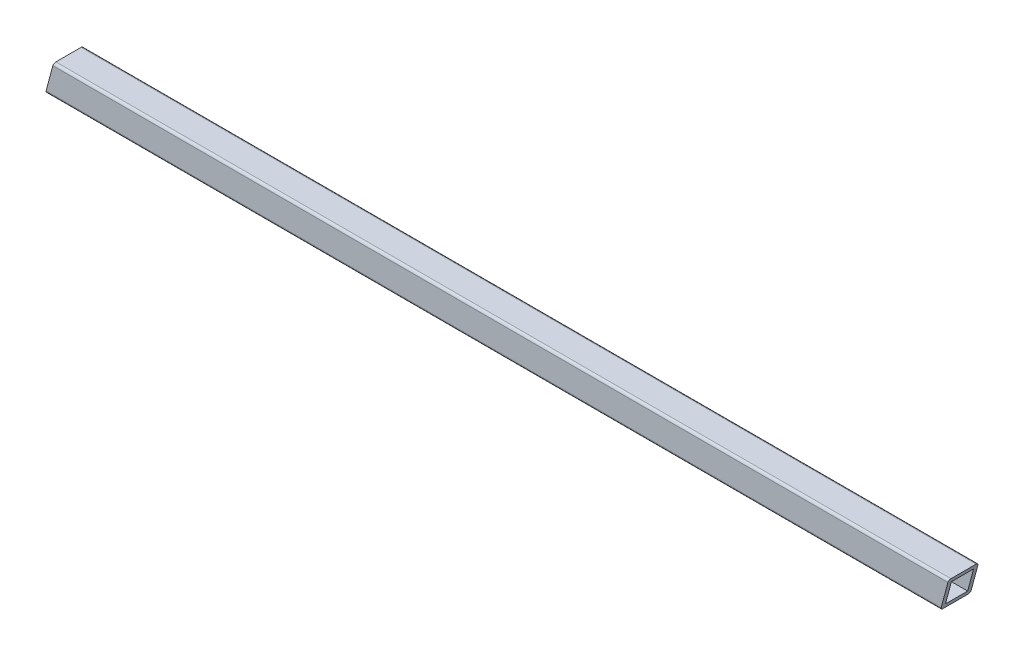
ISO-10303-21;
HEADER;
FILE_DESCRIPTION(('STEP AP214'),'2;1');
FILE_NAME('part.step','',(''),(''),'','','');
FILE_SCHEMA(('AUTOMOTIVE_DESIGN { 1 0 10303 214 1 1 1 1 }'));
ENDSEC;
DATA;
#1=APPLICATION_CONTEXT('core data for automotive mechanical design processes');
#2=APPLICATION_PROTOCOL_DEFINITION('international standard','automotive_design',2000,#1);
#3=PRODUCT_CONTEXT('',#1,'mechanical');
#4=PRODUCT('Part','Part','',(#3));
#5=PRODUCT_RELATED_PRODUCT_CATEGORY('part','',(#4));
#6=PRODUCT_DEFINITION_FORMATION('','',#4);
#7=PRODUCT_DEFINITION_CONTEXT('part definition',#1,'design');
#8=PRODUCT_DEFINITION('design','',#6,#7);
#9=PRODUCT_DEFINITION_SHAPE('','',#8);
#10=(LENGTH_UNIT() NAMED_UNIT(*) SI_UNIT(.MILLI.,.METRE.));
#11=(NAMED_UNIT(*) PLANE_ANGLE_UNIT() SI_UNIT($,.RADIAN.));
#12=(NAMED_UNIT(*) SI_UNIT($,.STERADIAN.) SOLID_ANGLE_UNIT());
#13=UNCERTAINTY_MEASURE_WITH_UNIT(LENGTH_MEASURE(1.E-05),#10,'distance_accuracy_value','');
#14=(GEOMETRIC_REPRESENTATION_CONTEXT(3) GLOBAL_UNCERTAINTY_ASSIGNED_CONTEXT((#13)) GLOBAL_UNIT_ASSIGNED_CONTEXT((#10,
#11,#12)) REPRESENTATION_CONTEXT('',''));
#15=CARTESIAN_POINT('',(0.,0.,0.));
#16=DIRECTION('',(0.,0.,1.));
#17=DIRECTION('',(1.,0.,0.));
#18=AXIS2_PLACEMENT_3D('',#15,#16,#17);
#19=CARTESIAN_POINT('',(1320.8,10.541,21.209));
#20=DIRECTION('',(-1.,0.,0.));
#21=DIRECTION('',(0.,0.,1.));
#22=AXIS2_PLACEMENT_3D('',#19,#20,#21);
#23=CYLINDRICAL_SURFACE('',#22,1.016);
#24=DIRECTION('',(-1.,0.,0.));
#25=VECTOR('',#24,1.);
#26=CARTESIAN_POINT('',(1320.8,9.525,21.209));
#27=LINE('',#26,#25);
#28=CARTESIAN_POINT('',(1236.83992704812,9.525,21.209));
#29=VERTEX_POINT('',#28);
#30=CARTESIAN_POINT('',(857.951824065148,9.525,21.209));
#31=VERTEX_POINT('',#30);
#32=EDGE_CURVE('E145',#29,#31,#27,.T.);
#33=ORIENTED_EDGE('',*,*,#32,.F.);
#34=CARTESIAN_POINT('',(1237.11216342763,10.541,21.209));
#35=DIRECTION('',(-0.965925826289069,0.258819045102516,0.));
#36=DIRECTION('',(-0.258819045102516,-0.965925826289069,0.));
#37=AXIS2_PLACEMENT_3D('',#34,#35,#36);
#38=ELLIPSE('',#37,1.05184059929664,1.016);
#39=CARTESIAN_POINT('',(1237.11216342763,10.541,22.225));
#40=VERTEX_POINT('',#39);
#41=EDGE_CURVE('E133',#29,#40,#38,.T.);
#42=ORIENTED_EDGE('',*,*,#41,.T.);
#43=DIRECTION('',(-1.,0.,0.));
#44=VECTOR('',#43,1.);
#45=CARTESIAN_POINT('',(1320.8,10.541,22.225));
#46=LINE('',#45,#44);
#47=CARTESIAN_POINT('',(858.224060444658,10.541,22.225));
#48=VERTEX_POINT('',#47);
#49=EDGE_CURVE('E143',#40,#48,#46,.T.);
#50=ORIENTED_EDGE('',*,*,#49,.T.);
#51=CARTESIAN_POINT('',(858.224060444658,10.541,21.209));
#52=DIRECTION('',(0.965925826289069,-0.258819045102516,0.));
#53=DIRECTION('',(-0.258819045102516,-0.965925826289069,0.));
#54=AXIS2_PLACEMENT_3D('',#51,#52,#53);
#55=ELLIPSE('',#54,1.05184059929664,1.016);
#56=EDGE_CURVE('E152',#48,#31,#55,.T.);
#57=ORIENTED_EDGE('',*,*,#56,.T.);
#58=EDGE_LOOP('',(#33,#42,#50,#57));
#59=FACE_BOUND('',#58,.T.);
#60=ADVANCED_FACE('F45',(#59),#23,.T.);
#61=CARTESIAN_POINT('',(1320.8,9.525,21.209));
#62=DIRECTION('',(0.,1.,0.));
#63=DIRECTION('',(0.,0.,1.));
#64=AXIS2_PLACEMENT_3D('',#61,#62,#63);
#65=PLANE('',#64);
#66=DIRECTION('',(-1.,0.,0.));
#67=VECTOR('',#66,1.);
#68=CARTESIAN_POINT('',(1320.8,9.525,10.541));
#69=LINE('',#68,#67);
#70=CARTESIAN_POINT('',(1236.83992704812,9.525,10.541));
#71=VERTEX_POINT('',#70);
#72=CARTESIAN_POINT('',(857.951824065148,9.525,10.541));
#73=VERTEX_POINT('',#72);
#74=EDGE_CURVE('E200',#71,#73,#69,.T.);
#75=ORIENTED_EDGE('',*,*,#74,.F.);
#76=DIRECTION('',(0.,0.,1.));
#77=VECTOR('',#76,1.);
#78=CARTESIAN_POINT('',(1236.83992704812,9.525,9.525));
#79=LINE('',#78,#77);
#80=EDGE_CURVE('E220',#71,#29,#79,.T.);
#81=ORIENTED_EDGE('',*,*,#80,.T.);
#82=ORIENTED_EDGE('',*,*,#32,.T.);
#83=DIRECTION('',(0.,0.,1.));
#84=VECTOR('',#83,1.);
#85=CARTESIAN_POINT('',(857.951824065148,9.525,9.525));
#86=LINE('',#85,#84);
#87=EDGE_CURVE('E53',#73,#31,#86,.T.);
#88=ORIENTED_EDGE('',*,*,#87,.F.);
#89=EDGE_LOOP('',(#75,#81,#82,#88));
#90=FACE_BOUND('',#89,.T.);
#91=ADVANCED_FACE('F219',(#90),#65,.F.);
#92=CARTESIAN_POINT('',(1320.8,10.541,10.541));
#93=DIRECTION('',(-1.,0.,0.));
#94=DIRECTION('',(0.,0.,1.));
#95=AXIS2_PLACEMENT_3D('',#92,#93,#94);
#96=CYLINDRICAL_SURFACE('',#95,1.016);
#97=DIRECTION('',(-1.,0.,0.));
#98=VECTOR('',#97,1.);
#99=CARTESIAN_POINT('',(1320.8,10.541,9.525));
#100=LINE('',#99,#98);
#101=CARTESIAN_POINT('',(1237.11216342763,10.541,9.525));
#102=VERTEX_POINT('',#101);
#103=CARTESIAN_POINT('',(858.224060444658,10.541,9.525));
#104=VERTEX_POINT('',#103);
#105=EDGE_CURVE('E198',#102,#104,#100,.T.);
#106=ORIENTED_EDGE('',*,*,#105,.F.);
#107=CARTESIAN_POINT('',(1237.11216342763,10.541,10.541));
#108=DIRECTION('',(-0.965925826289069,0.258819045102516,0.));
#109=DIRECTION('',(-0.258819045102516,-0.965925826289069,0.));
#110=AXIS2_PLACEMENT_3D('',#107,#108,#109);
#111=ELLIPSE('',#110,1.05184059929664,1.016);
#112=EDGE_CURVE('E146',#102,#71,#111,.T.);
#113=ORIENTED_EDGE('',*,*,#112,.T.);
#114=ORIENTED_EDGE('',*,*,#74,.T.);
#115=CARTESIAN_POINT('',(858.224060444658,10.541,10.541));
#116=DIRECTION('',(0.965925826289069,-0.258819045102516,0.));
#117=DIRECTION('',(-0.258819045102516,-0.965925826289069,0.));
#118=AXIS2_PLACEMENT_3D('',#115,#116,#117);
#119=ELLIPSE('',#118,1.05184059929664,1.016);
#120=EDGE_CURVE('E202',#73,#104,#119,.T.);
#121=ORIENTED_EDGE('',*,*,#120,.T.);
#122=EDGE_LOOP('',(#106,#113,#114,#121));
#123=FACE_BOUND('',#122,.T.);
#124=ADVANCED_FACE('F249',(#123),#96,.T.);
#125=CARTESIAN_POINT('',(1320.8,10.541,9.525));
#126=DIRECTION('',(0.,0.,1.));
#127=DIRECTION('',(1.,0.,0.));
#128=AXIS2_PLACEMENT_3D('',#125,#126,#127);
#129=PLANE('',#128);
#130=DIRECTION('',(-1.,0.,0.));
#131=VECTOR('',#130,1.);
#132=CARTESIAN_POINT('',(1320.8,21.209,9.525));
#133=LINE('',#132,#131);
#134=CARTESIAN_POINT('',(1239.97064541249,21.209,9.525));
#135=VERTEX_POINT('',#134);
#136=CARTESIAN_POINT('',(861.082542429514,21.209,9.525));
#137=VERTEX_POINT('',#136);
#138=EDGE_CURVE('E197',#135,#137,#133,.T.);
#139=ORIENTED_EDGE('',*,*,#138,.F.);
#140=DIRECTION('',(-0.258819045102516,-0.965925826289069,0.));
#141=VECTOR('',#140,1.);
#142=CARTESIAN_POINT('',(1240.242881792,22.225,9.525));
#143=LINE('',#142,#141);
#144=EDGE_CURVE('E138',#135,#102,#143,.T.);
#145=ORIENTED_EDGE('',*,*,#144,.T.);
#146=ORIENTED_EDGE('',*,*,#105,.T.);
#147=DIRECTION('',(0.258819045102516,0.965925826289069,0.));
#148=VECTOR('',#147,1.);
#149=CARTESIAN_POINT('',(861.354778809024,22.225,9.525));
#150=LINE('',#149,#148);
#151=EDGE_CURVE('E194',#104,#137,#150,.T.);
#152=ORIENTED_EDGE('',*,*,#151,.T.);
#153=EDGE_LOOP('',(#139,#145,#146,#152));
#154=FACE_BOUND('',#153,.T.);
#155=ADVANCED_FACE('F246',(#154),#129,.F.);
#156=CARTESIAN_POINT('',(1320.8,21.209,10.541));
#157=DIRECTION('',(-1.,0.,0.));
#158=DIRECTION('',(0.,0.,1.));
#159=AXIS2_PLACEMENT_3D('',#156,#157,#158);
#160=CYLINDRICAL_SURFACE('',#159,1.016);
#161=DIRECTION('',(-1.,0.,0.));
#162=VECTOR('',#161,1.);
#163=CARTESIAN_POINT('',(1320.8,22.225,10.541));
#164=LINE('',#163,#162);
#165=CARTESIAN_POINT('',(1240.242881792,22.225,10.541));
#166=VERTEX_POINT('',#165);
#167=CARTESIAN_POINT('',(861.354778809024,22.225,10.541));
#168=VERTEX_POINT('',#167);
#169=EDGE_CURVE('E192',#166,#168,#164,.T.);
#170=ORIENTED_EDGE('',*,*,#169,.F.);
#171=CARTESIAN_POINT('',(1239.97064541249,21.209,10.541));
#172=DIRECTION('',(-0.965925826289069,0.258819045102516,0.));
#173=DIRECTION('',(-0.258819045102516,-0.965925826289069,0.));
#174=AXIS2_PLACEMENT_3D('',#171,#172,#173);
#175=ELLIPSE('',#174,1.05184059929664,1.016);
#176=EDGE_CURVE('E234',#166,#135,#175,.T.);
#177=ORIENTED_EDGE('',*,*,#176,.T.);
#178=ORIENTED_EDGE('',*,*,#138,.T.);
#179=CARTESIAN_POINT('',(861.082542429514,21.209,10.541));
#180=DIRECTION('',(0.965925826289069,-0.258819045102516,0.));
#181=DIRECTION('',(-0.258819045102516,-0.965925826289069,0.));
#182=AXIS2_PLACEMENT_3D('',#179,#180,#181);
#183=ELLIPSE('',#182,1.05184059929664,1.016);
#184=EDGE_CURVE('E205',#137,#168,#183,.T.);
#185=ORIENTED_EDGE('',*,*,#184,.T.);
#186=EDGE_LOOP('',(#170,#177,#178,#185));
#187=FACE_BOUND('',#186,.T.);
#188=ADVANCED_FACE('F243',(#187),#160,.T.);
#189=CARTESIAN_POINT('',(1320.8,22.225,10.541));
#190=DIRECTION('',(0.,-1.,0.));
#191=DIRECTION('',(0.,0.,-1.));
#192=AXIS2_PLACEMENT_3D('',#189,#190,#191);
#193=PLANE('',#192);
#194=DIRECTION('',(-1.,0.,0.));
#195=VECTOR('',#194,1.);
#196=CARTESIAN_POINT('',(1320.8,22.225,21.209));
#197=LINE('',#196,#195);
#198=CARTESIAN_POINT('',(1240.242881792,22.225,21.209));
#199=VERTEX_POINT('',#198);
#200=CARTESIAN_POINT('',(861.354778809024,22.225,21.209));
#201=VERTEX_POINT('',#200);
#202=EDGE_CURVE('E191',#199,#201,#197,.T.);
#203=ORIENTED_EDGE('',*,*,#202,.F.);
#204=DIRECTION('',(0.,0.,1.));
#205=VECTOR('',#204,1.);
#206=CARTESIAN_POINT('',(1240.242881792,22.225,9.525));
#207=LINE('',#206,#205);
#208=EDGE_CURVE('E222',#166,#199,#207,.T.);
#209=ORIENTED_EDGE('',*,*,#208,.F.);
#210=ORIENTED_EDGE('',*,*,#169,.T.);
#211=DIRECTION('',(0.,0.,1.));
#212=VECTOR('',#211,1.);
#213=CARTESIAN_POINT('',(861.354778809024,22.225,9.525));
#214=LINE('',#213,#212);
#215=EDGE_CURVE('E188',#168,#201,#214,.T.);
#216=ORIENTED_EDGE('',*,*,#215,.T.);
#217=EDGE_LOOP('',(#203,#209,#210,#216));
#218=FACE_BOUND('',#217,.T.);
#219=ADVANCED_FACE('F252',(#218),#193,.F.);
#220=CARTESIAN_POINT('',(1320.8,21.209,21.209));
#221=DIRECTION('',(-1.,0.,0.));
#222=DIRECTION('',(0.,0.,1.));
#223=AXIS2_PLACEMENT_3D('',#220,#221,#222);
#224=CYLINDRICAL_SURFACE('',#223,1.016);
#225=DIRECTION('',(-1.,0.,0.));
#226=VECTOR('',#225,1.);
#227=CARTESIAN_POINT('',(1320.8,21.209,22.225));
#228=LINE('',#227,#226);
#229=CARTESIAN_POINT('',(1239.97064541249,21.209,22.225));
#230=VERTEX_POINT('',#229);
#231=CARTESIAN_POINT('',(861.082542429514,21.209,22.225));
#232=VERTEX_POINT('',#231);
#233=EDGE_CURVE('E157',#230,#232,#228,.T.);
#234=ORIENTED_EDGE('',*,*,#233,.F.);
#235=CARTESIAN_POINT('',(1239.97064541249,21.209,21.209));
#236=DIRECTION('',(-0.965925826289069,0.258819045102516,0.));
#237=DIRECTION('',(-0.258819045102516,-0.965925826289069,0.));
#238=AXIS2_PLACEMENT_3D('',#235,#236,#237);
#239=ELLIPSE('',#238,1.05184059929664,1.016);
#240=EDGE_CURVE('E60',#230,#199,#239,.T.);
#241=ORIENTED_EDGE('',*,*,#240,.T.);
#242=ORIENTED_EDGE('',*,*,#202,.T.);
#243=CARTESIAN_POINT('',(861.082542429514,21.209,21.209));
#244=DIRECTION('',(0.965925826289069,-0.258819045102516,0.));
#245=DIRECTION('',(-0.258819045102516,-0.965925826289069,0.));
#246=AXIS2_PLACEMENT_3D('',#243,#244,#245);
#247=ELLIPSE('',#246,1.05184059929664,1.016);
#248=EDGE_CURVE('E180',#201,#232,#247,.T.);
#249=ORIENTED_EDGE('',*,*,#248,.T.);
#250=EDGE_LOOP('',(#234,#241,#242,#249));
#251=FACE_BOUND('',#250,.T.);
#252=ADVANCED_FACE('F254',(#251),#224,.T.);
#253=CARTESIAN_POINT('',(1320.8,21.209,22.225));
#254=DIRECTION('',(0.,0.,-1.));
#255=DIRECTION('',(0.,1.,0.));
#256=AXIS2_PLACEMENT_3D('',#253,#254,#255);
#257=PLANE('',#256);
#258=ORIENTED_EDGE('',*,*,#49,.F.);
#259=DIRECTION('',(-0.258819045102516,-0.965925826289069,0.));
#260=VECTOR('',#259,1.);
#261=CARTESIAN_POINT('',(1240.242881792,22.225,22.225));
#262=LINE('',#261,#260);
#263=EDGE_CURVE('E130',#230,#40,#262,.T.);
#264=ORIENTED_EDGE('',*,*,#263,.F.);
#265=ORIENTED_EDGE('',*,*,#233,.T.);
#266=DIRECTION('',(0.258819045102516,0.965925826289069,0.));
#267=VECTOR('',#266,1.);
#268=CARTESIAN_POINT('',(861.354778809024,22.225,22.225));
#269=LINE('',#268,#267);
#270=EDGE_CURVE('E151',#48,#232,#269,.T.);
#271=ORIENTED_EDGE('',*,*,#270,.F.);
#272=EDGE_LOOP('',(#258,#264,#265,#271));
#273=FACE_BOUND('',#272,.T.);
#274=ADVANCED_FACE('F149',(#273),#257,.F.);
#275=CARTESIAN_POINT('',(1320.8,11.176,20.574));
#276=DIRECTION('',(0.,1.,0.));
#277=DIRECTION('',(0.,0.,1.));
#278=AXIS2_PLACEMENT_3D('',#275,#276,#277);
#279=PLANE('',#278);
#280=DIRECTION('',(0.,0.,1.));
#281=VECTOR('',#280,1.);
#282=CARTESIAN_POINT('',(1237.28231116483,11.176,20.574));
#283=LINE('',#282,#281);
#284=CARTESIAN_POINT('',(1237.28231116483,11.176,11.176));
#285=VERTEX_POINT('',#284);
#286=CARTESIAN_POINT('',(1237.28231116483,11.176,20.574));
#287=VERTEX_POINT('',#286);
#288=EDGE_CURVE('E67',#285,#287,#283,.T.);
#289=ORIENTED_EDGE('',*,*,#288,.F.);
#290=DIRECTION('',(-1.,0.,0.));
#291=VECTOR('',#290,1.);
#292=CARTESIAN_POINT('',(1320.8,11.176,11.176));
#293=LINE('',#292,#291);
#294=CARTESIAN_POINT('',(858.394208181852,11.176,11.176));
#295=VERTEX_POINT('',#294);
#296=EDGE_CURVE('E159',#285,#295,#293,.T.);
#297=ORIENTED_EDGE('',*,*,#296,.T.);
#298=DIRECTION('',(0.,0.,-1.));
#299=VECTOR('',#298,1.);
#300=CARTESIAN_POINT('',(858.394208181852,11.176,20.574));
#301=LINE('',#300,#299);
#302=CARTESIAN_POINT('',(858.394208181852,11.176,20.574));
#303=VERTEX_POINT('',#302);
#304=EDGE_CURVE('E165',#303,#295,#301,.T.);
#305=ORIENTED_EDGE('',*,*,#304,.F.);
#306=DIRECTION('',(-1.,0.,0.));
#307=VECTOR('',#306,1.);
#308=CARTESIAN_POINT('',(1320.8,11.176,20.574));
#309=LINE('',#308,#307);
#310=EDGE_CURVE('E164',#287,#303,#309,.T.);
#311=ORIENTED_EDGE('',*,*,#310,.F.);
#312=EDGE_LOOP('',(#289,#297,#305,#311));
#313=FACE_BOUND('',#312,.T.);
#314=ADVANCED_FACE('F47',(#313),#279,.T.);
#315=CARTESIAN_POINT('',(1320.8,11.176,11.176));
#316=DIRECTION('',(0.,0.,1.));
#317=DIRECTION('',(1.,0.,0.));
#318=AXIS2_PLACEMENT_3D('',#315,#316,#317);
#319=PLANE('',#318);
#320=DIRECTION('',(-0.258819045102516,-0.965925826289069,0.));
#321=VECTOR('',#320,1.);
#322=CARTESIAN_POINT('',(1242.8769354841,32.055422208793,11.176));
#323=LINE('',#322,#321);
#324=CARTESIAN_POINT('',(1239.80049767529,20.574,11.176));
#325=VERTEX_POINT('',#324);
#326=EDGE_CURVE('E230',#325,#285,#323,.T.);
#327=ORIENTED_EDGE('',*,*,#326,.F.);
#328=DIRECTION('',(-1.,0.,0.));
#329=VECTOR('',#328,1.);
#330=CARTESIAN_POINT('',(1320.8,20.574,11.176));
#331=LINE('',#330,#329);
#332=CARTESIAN_POINT('',(860.91239469232,20.574,11.176));
#333=VERTEX_POINT('',#332);
#334=EDGE_CURVE('E161',#325,#333,#331,.T.);
#335=ORIENTED_EDGE('',*,*,#334,.T.);
#336=DIRECTION('',(0.258819045102516,0.965925826289069,0.));
#337=VECTOR('',#336,1.);
#338=CARTESIAN_POINT('',(889.369522805138,126.777447954535,11.176));
#339=LINE('',#338,#337);
#340=EDGE_CURVE('E171',#295,#333,#339,.T.);
#341=ORIENTED_EDGE('',*,*,#340,.F.);
#342=ORIENTED_EDGE('',*,*,#296,.F.);
#343=EDGE_LOOP('',(#327,#335,#341,#342));
#344=FACE_BOUND('',#343,.T.);
#345=ADVANCED_FACE('F276',(#344),#319,.T.);
#346=CARTESIAN_POINT('',(1320.8,20.574,11.176));
#347=DIRECTION('',(0.,-1.,0.));
#348=DIRECTION('',(0.,0.,-1.));
#349=AXIS2_PLACEMENT_3D('',#346,#347,#348);
#350=PLANE('',#349);
#351=DIRECTION('',(0.,0.,-1.));
#352=VECTOR('',#351,1.);
#353=CARTESIAN_POINT('',(1239.80049767529,20.574,11.176));
#354=LINE('',#353,#352);
#355=CARTESIAN_POINT('',(1239.80049767529,20.574,20.574));
#356=VERTEX_POINT('',#355);
#357=EDGE_CURVE('E224',#356,#325,#354,.T.);
#358=ORIENTED_EDGE('',*,*,#357,.F.);
#359=DIRECTION('',(-1.,0.,0.));
#360=VECTOR('',#359,1.);
#361=CARTESIAN_POINT('',(1320.8,20.574,20.574));
#362=LINE('',#361,#360);
#363=CARTESIAN_POINT('',(860.91239469232,20.574,20.574));
#364=VERTEX_POINT('',#363);
#365=EDGE_CURVE('E163',#356,#364,#362,.T.);
#366=ORIENTED_EDGE('',*,*,#365,.T.);
#367=DIRECTION('',(0.,0.,1.));
#368=VECTOR('',#367,1.);
#369=CARTESIAN_POINT('',(860.91239469232,20.574,11.176));
#370=LINE('',#369,#368);
#371=EDGE_CURVE('E177',#333,#364,#370,.T.);
#372=ORIENTED_EDGE('',*,*,#371,.F.);
#373=ORIENTED_EDGE('',*,*,#334,.F.);
#374=EDGE_LOOP('',(#358,#366,#372,#373));
#375=FACE_BOUND('',#374,.T.);
#376=ADVANCED_FACE('F274',(#375),#350,.T.);
#377=CARTESIAN_POINT('',(1320.8,20.574,20.574));
#378=DIRECTION('',(0.,0.,-1.));
#379=DIRECTION('',(0.,1.,0.));
#380=AXIS2_PLACEMENT_3D('',#377,#378,#379);
#381=PLANE('',#380);
#382=DIRECTION('',(0.258819045102516,0.965925826289069,0.));
#383=VECTOR('',#382,1.);
#384=CARTESIAN_POINT('',(1245.2264354841,40.8238755811761,20.574));
#385=LINE('',#384,#383);
#386=EDGE_CURVE('E11',#287,#356,#385,.T.);
#387=ORIENTED_EDGE('',*,*,#386,.F.);
#388=ORIENTED_EDGE('',*,*,#310,.T.);
#389=DIRECTION('',(-0.258819045102516,-0.965925826289069,0.));
#390=VECTOR('',#389,1.);
#391=CARTESIAN_POINT('',(891.719022805138,135.545901326918,20.574));
#392=LINE('',#391,#390);
#393=EDGE_CURVE('E185',#364,#303,#392,.T.);
#394=ORIENTED_EDGE('',*,*,#393,.F.);
#395=ORIENTED_EDGE('',*,*,#365,.F.);
#396=EDGE_LOOP('',(#387,#388,#394,#395));
#397=FACE_BOUND('',#396,.T.);
#398=ADVANCED_FACE('F271',(#397),#381,.T.);
#399=CARTESIAN_POINT('',(861.354778809024,22.225,9.525));
#400=DIRECTION('',(0.965925826289069,-0.258819045102516,0.));
#401=DIRECTION('',(0.258819045102516,0.965925826289069,0.));
#402=AXIS2_PLACEMENT_3D('',#399,#400,#401);
#403=PLANE('',#402);
#404=ORIENTED_EDGE('',*,*,#304,.T.);
#405=ORIENTED_EDGE('',*,*,#340,.T.);
#406=ORIENTED_EDGE('',*,*,#371,.T.);
#407=ORIENTED_EDGE('',*,*,#393,.T.);
#408=EDGE_LOOP('',(#404,#405,#406,#407));
#409=FACE_BOUND('',#408,.T.);
#410=ORIENTED_EDGE('',*,*,#270,.T.);
#411=ORIENTED_EDGE('',*,*,#248,.F.);
#412=ORIENTED_EDGE('',*,*,#215,.F.);
#413=ORIENTED_EDGE('',*,*,#184,.F.);
#414=ORIENTED_EDGE('',*,*,#151,.F.);
#415=ORIENTED_EDGE('',*,*,#120,.F.);
#416=ORIENTED_EDGE('',*,*,#87,.T.);
#417=ORIENTED_EDGE('',*,*,#56,.F.);
#418=EDGE_LOOP('',(#410,#411,#412,#413,#414,#415,#416,#417));
#419=FACE_BOUND('',#418,.T.);
#420=ADVANCED_FACE('F211',(#409,#419),#403,.F.);
#421=CARTESIAN_POINT('',(1240.242881792,22.225,9.525));
#422=DIRECTION('',(-0.965925826289069,0.258819045102516,0.));
#423=DIRECTION('',(-0.258819045102516,-0.965925826289069,0.));
#424=AXIS2_PLACEMENT_3D('',#421,#422,#423);
#425=PLANE('',#424);
#426=ORIENTED_EDGE('',*,*,#288,.T.);
#427=ORIENTED_EDGE('',*,*,#386,.T.);
#428=ORIENTED_EDGE('',*,*,#357,.T.);
#429=ORIENTED_EDGE('',*,*,#326,.T.);
#430=EDGE_LOOP('',(#426,#427,#428,#429));
#431=FACE_BOUND('',#430,.T.);
#432=ORIENTED_EDGE('',*,*,#80,.F.);
#433=ORIENTED_EDGE('',*,*,#112,.F.);
#434=ORIENTED_EDGE('',*,*,#144,.F.);
#435=ORIENTED_EDGE('',*,*,#176,.F.);
#436=ORIENTED_EDGE('',*,*,#208,.T.);
#437=ORIENTED_EDGE('',*,*,#240,.F.);
#438=ORIENTED_EDGE('',*,*,#263,.T.);
#439=ORIENTED_EDGE('',*,*,#41,.F.);
#440=EDGE_LOOP('',(#432,#433,#434,#435,#436,#437,#438,#439));
#441=FACE_BOUND('',#440,.T.);
#442=ADVANCED_FACE('F132',(#431,#441),#425,.F.);
#443=CLOSED_SHELL('',(#60,#91,#124,#155,#188,#219,#252,#274,#314,#345,#376,#398,#420,#442));
#444=MANIFOLD_SOLID_BREP('B2',#443);
#445=ADVANCED_BREP_SHAPE_REPRESENTATION('',(#18,#444),#14);
#446=SHAPE_DEFINITION_REPRESENTATION(#9,#445);
ENDSEC;
END-ISO-10303-21;
